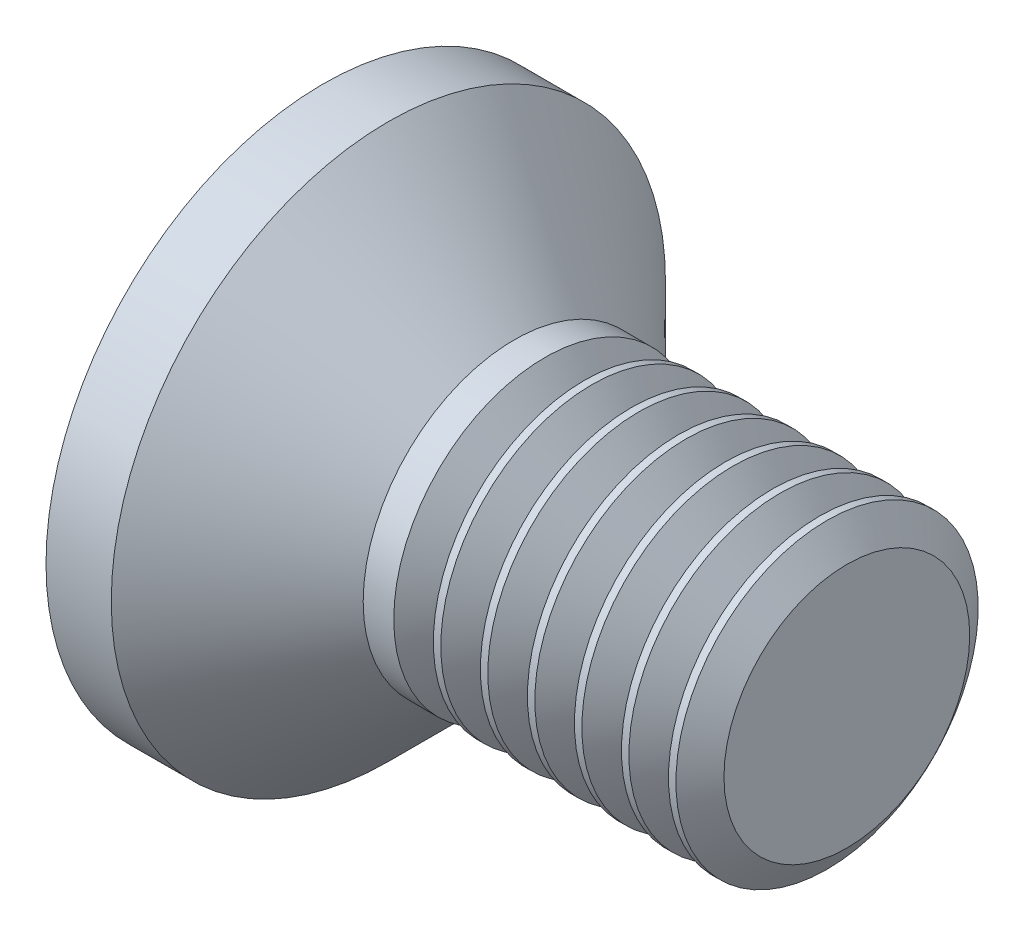
ISO-10303-21;
HEADER;
FILE_DESCRIPTION(('STEP AP214'),'2;1');
FILE_NAME('part.step','',(''),(''),'','','');
FILE_SCHEMA(('AUTOMOTIVE_DESIGN { 1 0 10303 214 1 1 1 1 }'));
ENDSEC;
DATA;
#1=APPLICATION_CONTEXT('core data for automotive mechanical design processes');
#2=APPLICATION_PROTOCOL_DEFINITION('international standard','automotive_design',2000,#1);
#3=PRODUCT_CONTEXT('',#1,'mechanical');
#4=PRODUCT('Part','Part','',(#3));
#5=PRODUCT_RELATED_PRODUCT_CATEGORY('part','',(#4));
#6=PRODUCT_DEFINITION_FORMATION('','',#4);
#7=PRODUCT_DEFINITION_CONTEXT('part definition',#1,'design');
#8=PRODUCT_DEFINITION('design','',#6,#7);
#9=PRODUCT_DEFINITION_SHAPE('','',#8);
#10=(LENGTH_UNIT() NAMED_UNIT(*) SI_UNIT(.MILLI.,.METRE.));
#11=(NAMED_UNIT(*) PLANE_ANGLE_UNIT() SI_UNIT($,.RADIAN.));
#12=(NAMED_UNIT(*) SI_UNIT($,.STERADIAN.) SOLID_ANGLE_UNIT());
#13=UNCERTAINTY_MEASURE_WITH_UNIT(LENGTH_MEASURE(1.E-05),#10,'distance_accuracy_value','');
#14=(GEOMETRIC_REPRESENTATION_CONTEXT(3) GLOBAL_UNCERTAINTY_ASSIGNED_CONTEXT((#13)) GLOBAL_UNIT_ASSIGNED_CONTEXT((#10,
#11,#12)) REPRESENTATION_CONTEXT('',''));
#15=CARTESIAN_POINT('',(0.,0.,0.));
#16=DIRECTION('',(0.,0.,1.));
#17=DIRECTION('',(1.,0.,0.));
#18=AXIS2_PLACEMENT_3D('',#15,#16,#17);
#19=CARTESIAN_POINT('',(7.4,0.,0.));
#20=DIRECTION('',(-1.,0.,0.));
#21=DIRECTION('',(0.,-1.,0.));
#22=AXIS2_PLACEMENT_3D('',#19,#20,#21);
#23=SPHERICAL_SURFACE('',#22,7.4);
#24=CARTESIAN_POINT('',(0.529956332016513,0.,0.));
#25=DIRECTION('',(-1.,0.,0.));
#26=DIRECTION('',(0.,0.,1.));
#27=AXIS2_PLACEMENT_3D('',#24,#25,#26);
#28=CIRCLE('',#27,2.75);
#29=CARTESIAN_POINT('',(0.529956332016513,0.,2.75));
#30=VERTEX_POINT('',#29);
#31=EDGE_CURVE('E158',#30,#30,#28,.T.);
#32=ORIENTED_EDGE('',*,*,#31,.T.);
#33=EDGE_LOOP('',(#32));
#34=FACE_BOUND('',#33,.T.);
#35=CARTESIAN_POINT('',(7.37844022875731,0.,-0.242092852990189));
#36=DIRECTION('',(-0.0887047329662643,0.,-0.996057965356125));
#37=DIRECTION('',(-0.996057965356125,0.,0.0887047329662643));
#38=AXIS2_PLACEMENT_3D('',#35,#36,#37);
#39=CIRCLE('',#38,7.39600745178066);
#40=CARTESIAN_POINT('',(0.185890101969758,1.59933099603895,0.398445409373938));
#41=VERTEX_POINT('',#40);
#42=CARTESIAN_POINT('',(0.0230796751196916,0.41294462120715,0.412944621207152));
#43=VERTEX_POINT('',#42);
#44=EDGE_CURVE('E129',#41,#43,#39,.F.);
#45=ORIENTED_EDGE('',*,*,#44,.T.);
#46=CARTESIAN_POINT('',(7.37844022875731,-0.24209285299019,0.));
#47=DIRECTION('',(-0.0887047329662644,-0.996057965356125,0.));
#48=DIRECTION('',(0.996057965356125,-0.0887047329662644,0.));
#49=AXIS2_PLACEMENT_3D('',#46,#47,#48);
#50=CIRCLE('',#49,7.39600745178066);
#51=CARTESIAN_POINT('',(0.185890101969758,0.398445409373932,1.59933099603895));
#52=VERTEX_POINT('',#51);
#53=EDGE_CURVE('E111',#43,#52,#50,.F.);
#54=ORIENTED_EDGE('',*,*,#53,.T.);
#55=CARTESIAN_POINT('',(5.99170841267437,0.,-2.16946737088841));
#56=DIRECTION('',(0.544482116778557,0.,0.838772450971264));
#57=DIRECTION('',(0.838772450971265,0.,-0.544482116778557));
#58=AXIS2_PLACEMENT_3D('',#55,#56,#57);
#59=CIRCLE('',#58,6.93326230080172);
#60=CARTESIAN_POINT('',(0.185890101969758,-0.398445409373943,1.59933099603894));
#61=VERTEX_POINT('',#60);
#62=EDGE_CURVE('E122',#61,#52,#59,.F.);
#63=ORIENTED_EDGE('',*,*,#62,.F.);
#64=CARTESIAN_POINT('',(7.37844022875731,0.242092852990189,0.));
#65=DIRECTION('',(-0.0887047329662643,0.996057965356125,0.));
#66=DIRECTION('',(-0.996057965356125,-0.0887047329662643,0.));
#67=AXIS2_PLACEMENT_3D('',#64,#65,#66);
#68=CIRCLE('',#67,7.39600745178066);
#69=CARTESIAN_POINT('',(0.0230796751196933,-0.412944621207153,0.412944621207151));
#70=VERTEX_POINT('',#69);
#71=EDGE_CURVE('E188',#61,#70,#68,.F.);
#72=ORIENTED_EDGE('',*,*,#71,.T.);
#73=CARTESIAN_POINT('',(0.185890101969757,-1.59933099603895,0.398445409373938));
#74=VERTEX_POINT('',#73);
#75=EDGE_CURVE('E163',#70,#74,#39,.F.);
#76=ORIENTED_EDGE('',*,*,#75,.T.);
#77=CARTESIAN_POINT('',(5.99170841267437,2.1694673708884,0.));
#78=DIRECTION('',(0.544482116778557,-0.838772450971264,0.));
#79=DIRECTION('',(0.838772450971265,0.544482116778557,0.));
#80=AXIS2_PLACEMENT_3D('',#77,#78,#79);
#81=CIRCLE('',#80,6.93326230080172);
#82=CARTESIAN_POINT('',(0.185890101969757,-1.59933099603895,-0.398445409373938));
#83=VERTEX_POINT('',#82);
#84=EDGE_CURVE('E161',#83,#74,#81,.F.);
#85=ORIENTED_EDGE('',*,*,#84,.F.);
#86=CARTESIAN_POINT('',(7.37844022875731,0.,0.24209285299019));
#87=DIRECTION('',(-0.0887047329662644,0.,0.996057965356125));
#88=DIRECTION('',(0.996057965356125,0.,0.0887047329662644));
#89=AXIS2_PLACEMENT_3D('',#86,#87,#88);
#90=CIRCLE('',#89,7.39600745178066);
#91=CARTESIAN_POINT('',(0.0230796751196933,-0.41294462120715,-0.412944621207152));
#92=VERTEX_POINT('',#91);
#93=EDGE_CURVE('E165',#83,#92,#90,.F.);
#94=ORIENTED_EDGE('',*,*,#93,.T.);
#95=CARTESIAN_POINT('',(0.185890101969757,-0.398445409373932,-1.59933099603895));
#96=VERTEX_POINT('',#95);
#97=EDGE_CURVE('E192',#92,#96,#68,.F.);
#98=ORIENTED_EDGE('',*,*,#97,.T.);
#99=CARTESIAN_POINT('',(5.99170841267437,0.,2.16946737088841));
#100=DIRECTION('',(0.544482116778557,0.,-0.838772450971264));
#101=DIRECTION('',(-0.838772450971265,0.,-0.544482116778557));
#102=AXIS2_PLACEMENT_3D('',#99,#100,#101);
#103=CIRCLE('',#102,6.93326230080172);
#104=CARTESIAN_POINT('',(0.185890101969757,0.398445409373944,-1.59933099603894));
#105=VERTEX_POINT('',#104);
#106=EDGE_CURVE('E123',#105,#96,#103,.F.);
#107=ORIENTED_EDGE('',*,*,#106,.F.);
#108=CARTESIAN_POINT('',(0.0230796751196933,0.412944621207153,-0.412944621207152));
#109=VERTEX_POINT('',#108);
#110=EDGE_CURVE('E148',#105,#109,#50,.F.);
#111=ORIENTED_EDGE('',*,*,#110,.T.);
#112=CARTESIAN_POINT('',(0.185890101969758,1.59933099603895,-0.398445409373938));
#113=VERTEX_POINT('',#112);
#114=EDGE_CURVE('E62',#109,#113,#90,.F.);
#115=ORIENTED_EDGE('',*,*,#114,.T.);
#116=CARTESIAN_POINT('',(5.99170841267437,-2.1694673708884,0.));
#117=DIRECTION('',(0.544482116778557,0.838772450971264,0.));
#118=DIRECTION('',(-0.838772450971265,0.544482116778557,0.));
#119=AXIS2_PLACEMENT_3D('',#116,#117,#118);
#120=CIRCLE('',#119,6.93326230080172);
#121=EDGE_CURVE('E47',#41,#113,#120,.F.);
#122=ORIENTED_EDGE('',*,*,#121,.F.);
#123=EDGE_LOOP('',(#45,#54,#63,#72,#76,#85,#94,#98,#107,#111,#115,#122));
#124=FACE_BOUND('',#123,.T.);
#125=ADVANCED_FACE('F39',(#34,#124),#23,.T.);
#126=CARTESIAN_POINT('',(2.64965289256198,0.,-0.17903305785124));
#127=DIRECTION('',(-0.0887047329662644,0.,0.996057965356125));
#128=DIRECTION('',(0.996057965356125,0.,0.0887047329662644));
#129=AXIS2_PLACEMENT_3D('',#126,#127,#128);
#130=PLANE('',#129);
#131=ORIENTED_EDGE('',*,*,#114,.F.);
#132=DIRECTION('',(0.992162185069946,-0.0883577911596629,0.0883577911596626));
#133=VECTOR('',#132,1.);
#134=CARTESIAN_POINT('',(2.66534787197402,0.177635328998022,-0.177635328998022));
#135=LINE('',#134,#133);
#136=CARTESIAN_POINT('',(2.33,0.207500000000001,-0.207499999999999));
#137=VERTEX_POINT('',#136);
#138=EDGE_CURVE('E170',#109,#137,#135,.T.);
#139=ORIENTED_EDGE('',*,*,#138,.T.);
#140=DIRECTION('',(0.836442139156631,-0.542969414366697,0.0744900188304725));
#141=VECTOR('',#140,1.);
#142=CARTESIAN_POINT('',(0.,1.72,-0.415));
#143=LINE('',#142,#141);
#144=EDGE_CURVE('E132',#113,#137,#143,.T.);
#145=ORIENTED_EDGE('',*,*,#144,.F.);
#146=EDGE_LOOP('',(#131,#139,#145));
#147=FACE_BOUND('',#146,.T.);
#148=ADVANCED_FACE('F169',(#147),#130,.T.);
#149=DIRECTION('',(0.836442139156631,0.542969414366697,0.0744900188304725));
#150=VECTOR('',#149,1.);
#151=CARTESIAN_POINT('',(0.,-1.72,-0.415));
#152=LINE('',#151,#150);
#153=CARTESIAN_POINT('',(2.33,-0.2075,-0.2075));
#154=VERTEX_POINT('',#153);
#155=EDGE_CURVE('E54',#83,#154,#152,.T.);
#156=ORIENTED_EDGE('',*,*,#155,.T.);
#157=DIRECTION('',(-0.992162185069946,-0.0883577911596622,-0.0883577911596626));
#158=VECTOR('',#157,1.);
#159=CARTESIAN_POINT('',(2.66534787197402,-0.177635328998021,-0.177635328998022));
#160=LINE('',#159,#158);
#161=EDGE_CURVE('E190',#154,#92,#160,.T.);
#162=ORIENTED_EDGE('',*,*,#161,.T.);
#163=ORIENTED_EDGE('',*,*,#93,.F.);
#164=EDGE_LOOP('',(#156,#162,#163));
#165=FACE_BOUND('',#164,.T.);
#166=ADVANCED_FACE('F287',(#165),#130,.T.);
#167=CARTESIAN_POINT('',(2.64965289256198,0.,0.17903305785124));
#168=DIRECTION('',(-0.0887047329662643,0.,-0.996057965356125));
#169=DIRECTION('',(-0.996057965356125,0.,0.0887047329662643));
#170=AXIS2_PLACEMENT_3D('',#167,#168,#169);
#171=PLANE('',#170);
#172=DIRECTION('',(0.836442139156631,-0.542969414366697,-0.0744900188304725));
#173=VECTOR('',#172,1.);
#174=CARTESIAN_POINT('',(0.,1.72,0.415));
#175=LINE('',#174,#173);
#176=CARTESIAN_POINT('',(2.33,0.207499999999999,0.207500000000001));
#177=VERTEX_POINT('',#176);
#178=EDGE_CURVE('E127',#41,#177,#175,.T.);
#179=ORIENTED_EDGE('',*,*,#178,.T.);
#180=DIRECTION('',(-0.992162185069947,0.0883577911596623,0.0883577911596626));
#181=VECTOR('',#180,1.);
#182=CARTESIAN_POINT('',(2.66534787197402,0.177635328998021,0.177635328998022));
#183=LINE('',#182,#181);
#184=EDGE_CURVE('E11',#177,#43,#183,.T.);
#185=ORIENTED_EDGE('',*,*,#184,.T.);
#186=ORIENTED_EDGE('',*,*,#44,.F.);
#187=EDGE_LOOP('',(#179,#185,#186));
#188=FACE_BOUND('',#187,.T.);
#189=ADVANCED_FACE('F128',(#188),#171,.T.);
#190=ORIENTED_EDGE('',*,*,#75,.F.);
#191=DIRECTION('',(0.992162185069946,0.0883577911596628,-0.0883577911596625));
#192=VECTOR('',#191,1.);
#193=CARTESIAN_POINT('',(2.66534787197402,-0.177635328998022,0.177635328998022));
#194=LINE('',#193,#192);
#195=CARTESIAN_POINT('',(2.33,-0.2075,0.2075));
#196=VERTEX_POINT('',#195);
#197=EDGE_CURVE('E185',#70,#196,#194,.T.);
#198=ORIENTED_EDGE('',*,*,#197,.T.);
#199=DIRECTION('',(0.836442139156631,0.542969414366697,-0.0744900188304724));
#200=VECTOR('',#199,1.);
#201=CARTESIAN_POINT('',(0.,-1.72,0.415));
#202=LINE('',#201,#200);
#203=EDGE_CURVE('E176',#74,#196,#202,.T.);
#204=ORIENTED_EDGE('',*,*,#203,.F.);
#205=EDGE_LOOP('',(#190,#198,#204));
#206=FACE_BOUND('',#205,.T.);
#207=ADVANCED_FACE('F184',(#206),#171,.T.);
#208=CARTESIAN_POINT('',(-15.875,0.,0.));
#209=DIRECTION('',(-1.,0.,0.));
#210=DIRECTION('',(0.,0.,1.));
#211=AXIS2_PLACEMENT_3D('',#208,#209,#210);
#212=CYLINDRICAL_SURFACE('',#211,2.75);
#213=ORIENTED_EDGE('',*,*,#31,.F.);
#214=EDGE_LOOP('',(#213));
#215=FACE_BOUND('',#214,.T.);
#216=CARTESIAN_POINT('',(1.1776690729551,0.,0.));
#217=DIRECTION('',(-1.,0.,0.));
#218=DIRECTION('',(0.,0.,1.));
#219=AXIS2_PLACEMENT_3D('',#216,#217,#218);
#220=CIRCLE('',#219,2.75);
#221=CARTESIAN_POINT('',(1.1776690729551,0.,2.75));
#222=VERTEX_POINT('',#221);
#223=EDGE_CURVE('E155',#222,#222,#220,.T.);
#224=ORIENTED_EDGE('',*,*,#223,.T.);
#225=EDGE_LOOP('',(#224));
#226=FACE_BOUND('',#225,.T.);
#227=ADVANCED_FACE('F290',(#215,#226),#212,.T.);
#228=CARTESIAN_POINT('',(2.42766907295509,0.,0.));
#229=DIRECTION('',(-1.,0.,0.));
#230=DIRECTION('',(0.,0.,1.));
#231=AXIS2_PLACEMENT_3D('',#228,#229,#230);
#232=CONICAL_SURFACE('',#231,1.5,0.785398163397451);
#233=ORIENTED_EDGE('',*,*,#223,.F.);
#234=EDGE_LOOP('',(#233));
#235=FACE_BOUND('',#234,.T.);
#236=CARTESIAN_POINT('',(2.42766907295509,0.,0.));
#237=DIRECTION('',(-1.,0.,0.));
#238=DIRECTION('',(0.,0.,1.));
#239=AXIS2_PLACEMENT_3D('',#236,#237,#238);
#240=CIRCLE('',#239,1.5);
#241=CARTESIAN_POINT('',(2.42766907295509,0.,1.5));
#242=VERTEX_POINT('',#241);
#243=EDGE_CURVE('E152',#242,#242,#240,.T.);
#244=ORIENTED_EDGE('',*,*,#243,.T.);
#245=EDGE_LOOP('',(#244));
#246=FACE_BOUND('',#245,.T.);
#247=ADVANCED_FACE('F293',(#235,#246),#232,.T.);
#248=CARTESIAN_POINT('',(-15.875,0.,0.));
#249=DIRECTION('',(-1.,0.,0.));
#250=DIRECTION('',(0.,0.,1.));
#251=AXIS2_PLACEMENT_3D('',#248,#249,#250);
#252=CYLINDRICAL_SURFACE('',#251,1.5);
#253=CARTESIAN_POINT('',(2.73126085848727,0.,0.));
#254=DIRECTION('',(-1.,0.,0.));
#255=DIRECTION('',(0.,-1.,0.));
#256=AXIS2_PLACEMENT_3D('',#253,#254,#255);
#257=CIRCLE('',#256,1.5);
#258=CARTESIAN_POINT('',(2.73126085848727,-1.5,0.));
#259=VERTEX_POINT('',#258);
#260=EDGE_CURVE('E214',#259,#259,#257,.T.);
#261=ORIENTED_EDGE('',*,*,#260,.T.);
#262=EDGE_LOOP('',(#261));
#263=FACE_BOUND('',#262,.T.);
#264=ORIENTED_EDGE('',*,*,#243,.F.);
#265=EDGE_LOOP('',(#264));
#266=FACE_BOUND('',#265,.T.);
#267=ADVANCED_FACE('F296',(#263,#266),#252,.T.);
#268=CARTESIAN_POINT('',(2.33,0.2075,-0.2075));
#269=DIRECTION('',(-1.,0.,0.));
#270=DIRECTION('',(0.,0.,1.));
#271=AXIS2_PLACEMENT_3D('',#268,#269,#270);
#272=PLANE('',#271);
#273=DIRECTION('',(0.,1.,0.));
#274=VECTOR('',#273,1.);
#275=CARTESIAN_POINT('',(2.33,-0.2075,-0.2075));
#276=LINE('',#275,#274);
#277=EDGE_CURVE('E145',#154,#137,#276,.T.);
#278=ORIENTED_EDGE('',*,*,#277,.F.);
#279=DIRECTION('',(0.,0.,1.));
#280=VECTOR('',#279,1.);
#281=CARTESIAN_POINT('',(2.33,-0.2075,-0.2075));
#282=LINE('',#281,#280);
#283=EDGE_CURVE('E140',#154,#196,#282,.T.);
#284=ORIENTED_EDGE('',*,*,#283,.T.);
#285=DIRECTION('',(0.,-1.,0.));
#286=VECTOR('',#285,1.);
#287=CARTESIAN_POINT('',(2.33,0.2075,0.2075));
#288=LINE('',#287,#286);
#289=EDGE_CURVE('E119',#177,#196,#288,.T.);
#290=ORIENTED_EDGE('',*,*,#289,.F.);
#291=DIRECTION('',(0.,0.,-1.));
#292=VECTOR('',#291,1.);
#293=CARTESIAN_POINT('',(2.33,0.2075,0.2075));
#294=LINE('',#293,#292);
#295=EDGE_CURVE('E139',#177,#137,#294,.T.);
#296=ORIENTED_EDGE('',*,*,#295,.T.);
#297=EDGE_LOOP('',(#278,#284,#290,#296));
#298=FACE_BOUND('',#297,.T.);
#299=ADVANCED_FACE('F138',(#298),#272,.T.);
#300=CARTESIAN_POINT('',(2.33,0.2075,0.2075));
#301=DIRECTION('',(0.544482116778557,0.838772450971264,0.));
#302=DIRECTION('',(-0.838772450971265,0.544482116778557,0.));
#303=AXIS2_PLACEMENT_3D('',#300,#301,#302);
#304=PLANE('',#303);
#305=ORIENTED_EDGE('',*,*,#121,.T.);
#306=ORIENTED_EDGE('',*,*,#144,.T.);
#307=ORIENTED_EDGE('',*,*,#295,.F.);
#308=ORIENTED_EDGE('',*,*,#178,.F.);
#309=EDGE_LOOP('',(#305,#306,#307,#308));
#310=FACE_BOUND('',#309,.T.);
#311=ADVANCED_FACE('F143',(#310),#304,.F.);
#312=CARTESIAN_POINT('',(2.33,-0.2075,-0.2075));
#313=DIRECTION('',(0.544482116778557,-0.838772450971264,0.));
#314=DIRECTION('',(0.838772450971265,0.544482116778557,0.));
#315=AXIS2_PLACEMENT_3D('',#312,#313,#314);
#316=PLANE('',#315);
#317=ORIENTED_EDGE('',*,*,#84,.T.);
#318=ORIENTED_EDGE('',*,*,#203,.T.);
#319=ORIENTED_EDGE('',*,*,#283,.F.);
#320=ORIENTED_EDGE('',*,*,#155,.F.);
#321=EDGE_LOOP('',(#317,#318,#319,#320));
#322=FACE_BOUND('',#321,.T.);
#323=ADVANCED_FACE('F179',(#322),#316,.F.);
#324=CARTESIAN_POINT('',(2.64965289256198,0.17903305785124,0.));
#325=DIRECTION('',(-0.0887047329662644,-0.996057965356125,0.));
#326=DIRECTION('',(0.996057965356125,-0.0887047329662644,0.));
#327=AXIS2_PLACEMENT_3D('',#324,#325,#326);
#328=PLANE('',#327);
#329=ORIENTED_EDGE('',*,*,#184,.F.);
#330=DIRECTION('',(0.836442139156631,-0.0744900188304706,-0.542969414366698));
#331=VECTOR('',#330,1.);
#332=CARTESIAN_POINT('',(0.,0.414999999999994,1.72));
#333=LINE('',#332,#331);
#334=EDGE_CURVE('E109',#52,#177,#333,.T.);
#335=ORIENTED_EDGE('',*,*,#334,.F.);
#336=ORIENTED_EDGE('',*,*,#53,.F.);
#337=EDGE_LOOP('',(#329,#335,#336));
#338=FACE_BOUND('',#337,.T.);
#339=ADVANCED_FACE('F108',(#338),#328,.T.);
#340=CARTESIAN_POINT('',(2.64965289256198,-0.17903305785124,0.));
#341=DIRECTION('',(-0.0887047329662643,0.996057965356125,0.));
#342=DIRECTION('',(-0.996057965356125,-0.0887047329662643,0.));
#343=AXIS2_PLACEMENT_3D('',#340,#341,#342);
#344=PLANE('',#343);
#345=DIRECTION('',(0.836442139156631,0.0744900188304744,-0.542969414366697));
#346=VECTOR('',#345,1.);
#347=CARTESIAN_POINT('',(0.,-0.415000000000006,1.72));
#348=LINE('',#347,#346);
#349=EDGE_CURVE('E124',#61,#196,#348,.T.);
#350=ORIENTED_EDGE('',*,*,#349,.T.);
#351=ORIENTED_EDGE('',*,*,#197,.F.);
#352=ORIENTED_EDGE('',*,*,#71,.F.);
#353=EDGE_LOOP('',(#350,#351,#352));
#354=FACE_BOUND('',#353,.T.);
#355=ADVANCED_FACE('F314',(#354),#344,.T.);
#356=CARTESIAN_POINT('',(2.33,-0.207500000000001,0.207499999999999));
#357=DIRECTION('',(0.544482116778557,0.,0.838772450971264));
#358=DIRECTION('',(-0.838772450971265,0.,0.544482116778557));
#359=AXIS2_PLACEMENT_3D('',#356,#357,#358);
#360=PLANE('',#359);
#361=ORIENTED_EDGE('',*,*,#62,.T.);
#362=ORIENTED_EDGE('',*,*,#334,.T.);
#363=ORIENTED_EDGE('',*,*,#289,.T.);
#364=ORIENTED_EDGE('',*,*,#349,.F.);
#365=EDGE_LOOP('',(#361,#362,#363,#364));
#366=FACE_BOUND('',#365,.T.);
#367=ADVANCED_FACE('F116',(#366),#360,.F.);
#368=DIRECTION('',(0.836442139156631,-0.0744900188304744,0.542969414366697));
#369=VECTOR('',#368,1.);
#370=CARTESIAN_POINT('',(0.,0.415000000000006,-1.72));
#371=LINE('',#370,#369);
#372=EDGE_CURVE('E203',#105,#137,#371,.T.);
#373=ORIENTED_EDGE('',*,*,#372,.T.);
#374=ORIENTED_EDGE('',*,*,#138,.F.);
#375=ORIENTED_EDGE('',*,*,#110,.F.);
#376=EDGE_LOOP('',(#373,#374,#375));
#377=FACE_BOUND('',#376,.T.);
#378=ADVANCED_FACE('F202',(#377),#328,.T.);
#379=ORIENTED_EDGE('',*,*,#161,.F.);
#380=DIRECTION('',(0.836442139156631,0.0744900188304705,0.542969414366698));
#381=VECTOR('',#380,1.);
#382=CARTESIAN_POINT('',(0.,-0.414999999999994,-1.72));
#383=LINE('',#382,#381);
#384=EDGE_CURVE('E207',#96,#154,#383,.T.);
#385=ORIENTED_EDGE('',*,*,#384,.F.);
#386=ORIENTED_EDGE('',*,*,#97,.F.);
#387=EDGE_LOOP('',(#379,#385,#386));
#388=FACE_BOUND('',#387,.T.);
#389=ADVANCED_FACE('F313',(#388),#344,.T.);
#390=CARTESIAN_POINT('',(2.33,0.207500000000001,-0.207499999999999));
#391=DIRECTION('',(0.544482116778557,0.,-0.838772450971264));
#392=DIRECTION('',(0.838772450971265,0.,0.544482116778557));
#393=AXIS2_PLACEMENT_3D('',#390,#391,#392);
#394=PLANE('',#393);
#395=ORIENTED_EDGE('',*,*,#106,.T.);
#396=ORIENTED_EDGE('',*,*,#384,.T.);
#397=ORIENTED_EDGE('',*,*,#277,.T.);
#398=ORIENTED_EDGE('',*,*,#372,.F.);
#399=EDGE_LOOP('',(#395,#396,#397,#398));
#400=FACE_BOUND('',#399,.T.);
#401=ADVANCED_FACE('F205',(#400),#394,.F.);
#402=CARTESIAN_POINT('',(3.12407728742291,0.,0.));
#403=DIRECTION('',(1.,0.,0.));
#404=DIRECTION('',(0.,1.,0.));
#405=AXIS2_PLACEMENT_3D('',#402,#403,#404);
#406=CONICAL_SURFACE('',#405,1.5,0.959931088596885);
#407=CARTESIAN_POINT('',(2.92766907295509,0.,0.));
#408=DIRECTION('',(-1.,0.,0.));
#409=DIRECTION('',(0.,-1.,0.));
#410=AXIS2_PLACEMENT_3D('',#407,#408,#409);
#411=CIRCLE('',#410,1.2195);
#412=CARTESIAN_POINT('',(2.92766907295509,-1.2195,0.));
#413=VERTEX_POINT('',#412);
#414=EDGE_CURVE('E217',#413,#413,#411,.T.);
#415=ORIENTED_EDGE('',*,*,#414,.F.);
#416=EDGE_LOOP('',(#415));
#417=FACE_BOUND('',#416,.T.);
#418=CARTESIAN_POINT('',(3.12407728742291,0.,0.));
#419=DIRECTION('',(-1.,0.,0.));
#420=DIRECTION('',(0.,-1.,0.));
#421=AXIS2_PLACEMENT_3D('',#418,#419,#420);
#422=CIRCLE('',#421,1.5);
#423=CARTESIAN_POINT('',(3.12407728742291,-1.5,0.));
#424=VERTEX_POINT('',#423);
#425=EDGE_CURVE('E210',#424,#424,#422,.T.);
#426=ORIENTED_EDGE('',*,*,#425,.T.);
#427=EDGE_LOOP('',(#426));
#428=FACE_BOUND('',#427,.T.);
#429=ADVANCED_FACE('F312',(#417,#428),#406,.T.);
#430=CARTESIAN_POINT('',(2.92766907295509,0.,0.));
#431=DIRECTION('',(-1.,0.,0.));
#432=DIRECTION('',(0.,-1.,0.));
#433=AXIS2_PLACEMENT_3D('',#430,#431,#432);
#434=CONICAL_SURFACE('',#433,1.2195,0.959931088596876);
#435=ORIENTED_EDGE('',*,*,#260,.F.);
#436=EDGE_LOOP('',(#435));
#437=FACE_BOUND('',#436,.T.);
#438=ORIENTED_EDGE('',*,*,#414,.T.);
#439=EDGE_LOOP('',(#438));
#440=FACE_BOUND('',#439,.T.);
#441=ADVANCED_FACE('F323',(#437,#440),#434,.T.);
#442=CARTESIAN_POINT('',(3.19792752515393,0.,0.));
#443=DIRECTION('',(-1.,0.,0.));
#444=DIRECTION('',(0.,-1.,0.));
#445=AXIS2_PLACEMENT_3D('',#442,#443,#444);
#446=CIRCLE('',#445,1.5);
#447=CARTESIAN_POINT('',(3.19792752515393,-1.5,0.));
#448=VERTEX_POINT('',#447);
#449=EDGE_CURVE('E223',#448,#448,#446,.T.);
#450=ORIENTED_EDGE('',*,*,#449,.T.);
#451=EDGE_LOOP('',(#450));
#452=FACE_BOUND('',#451,.T.);
#453=ORIENTED_EDGE('',*,*,#425,.F.);
#454=EDGE_LOOP('',(#453));
#455=FACE_BOUND('',#454,.T.);
#456=ADVANCED_FACE('F301',(#452,#455),#252,.T.);
#457=CARTESIAN_POINT('',(3.59074395408958,0.,0.));
#458=DIRECTION('',(1.,0.,0.));
#459=DIRECTION('',(0.,1.,0.));
#460=AXIS2_PLACEMENT_3D('',#457,#458,#459);
#461=CONICAL_SURFACE('',#460,1.5,0.959931088596885);
#462=CARTESIAN_POINT('',(3.39433573962176,0.,0.));
#463=DIRECTION('',(-1.,0.,0.));
#464=DIRECTION('',(0.,-1.,0.));
#465=AXIS2_PLACEMENT_3D('',#462,#463,#464);
#466=CIRCLE('',#465,1.2195);
#467=CARTESIAN_POINT('',(3.39433573962176,-1.2195,0.));
#468=VERTEX_POINT('',#467);
#469=EDGE_CURVE('E226',#468,#468,#466,.T.);
#470=ORIENTED_EDGE('',*,*,#469,.F.);
#471=EDGE_LOOP('',(#470));
#472=FACE_BOUND('',#471,.T.);
#473=CARTESIAN_POINT('',(3.59074395408958,0.,0.));
#474=DIRECTION('',(-1.,0.,0.));
#475=DIRECTION('',(0.,-1.,0.));
#476=AXIS2_PLACEMENT_3D('',#473,#474,#475);
#477=CIRCLE('',#476,1.5);
#478=CARTESIAN_POINT('',(3.59074395408958,-1.5,0.));
#479=VERTEX_POINT('',#478);
#480=EDGE_CURVE('E220',#479,#479,#477,.T.);
#481=ORIENTED_EDGE('',*,*,#480,.T.);
#482=EDGE_LOOP('',(#481));
#483=FACE_BOUND('',#482,.T.);
#484=ADVANCED_FACE('F328',(#472,#483),#461,.T.);
#485=CARTESIAN_POINT('',(3.39433573962176,0.,0.));
#486=DIRECTION('',(-1.,0.,0.));
#487=DIRECTION('',(0.,-1.,0.));
#488=AXIS2_PLACEMENT_3D('',#485,#486,#487);
#489=CONICAL_SURFACE('',#488,1.2195,0.959931088596876);
#490=ORIENTED_EDGE('',*,*,#449,.F.);
#491=EDGE_LOOP('',(#490));
#492=FACE_BOUND('',#491,.T.);
#493=ORIENTED_EDGE('',*,*,#469,.T.);
#494=EDGE_LOOP('',(#493));
#495=FACE_BOUND('',#494,.T.);
#496=ADVANCED_FACE('F331',(#492,#495),#489,.T.);
#497=CARTESIAN_POINT('',(3.6645941918206,0.,0.));
#498=DIRECTION('',(-1.,0.,0.));
#499=DIRECTION('',(0.,-1.,0.));
#500=AXIS2_PLACEMENT_3D('',#497,#498,#499);
#501=CIRCLE('',#500,1.5);
#502=CARTESIAN_POINT('',(3.6645941918206,-1.5,0.));
#503=VERTEX_POINT('',#502);
#504=EDGE_CURVE('E232',#503,#503,#501,.T.);
#505=ORIENTED_EDGE('',*,*,#504,.T.);
#506=EDGE_LOOP('',(#505));
#507=FACE_BOUND('',#506,.T.);
#508=ORIENTED_EDGE('',*,*,#480,.F.);
#509=EDGE_LOOP('',(#508));
#510=FACE_BOUND('',#509,.T.);
#511=ADVANCED_FACE('F335',(#507,#510),#252,.T.);
#512=CARTESIAN_POINT('',(4.05741062075625,0.,0.));
#513=DIRECTION('',(1.,0.,0.));
#514=DIRECTION('',(0.,1.,0.));
#515=AXIS2_PLACEMENT_3D('',#512,#513,#514);
#516=CONICAL_SURFACE('',#515,1.5,0.959931088596885);
#517=CARTESIAN_POINT('',(3.86100240628842,0.,0.));
#518=DIRECTION('',(-1.,0.,0.));
#519=DIRECTION('',(0.,-1.,0.));
#520=AXIS2_PLACEMENT_3D('',#517,#518,#519);
#521=CIRCLE('',#520,1.2195);
#522=CARTESIAN_POINT('',(3.86100240628842,-1.2195,0.));
#523=VERTEX_POINT('',#522);
#524=EDGE_CURVE('E235',#523,#523,#521,.T.);
#525=ORIENTED_EDGE('',*,*,#524,.F.);
#526=EDGE_LOOP('',(#525));
#527=FACE_BOUND('',#526,.T.);
#528=CARTESIAN_POINT('',(4.05741062075625,0.,0.));
#529=DIRECTION('',(-1.,0.,0.));
#530=DIRECTION('',(0.,-1.,0.));
#531=AXIS2_PLACEMENT_3D('',#528,#529,#530);
#532=CIRCLE('',#531,1.5);
#533=CARTESIAN_POINT('',(4.05741062075625,-1.5,0.));
#534=VERTEX_POINT('',#533);
#535=EDGE_CURVE('E229',#534,#534,#532,.T.);
#536=ORIENTED_EDGE('',*,*,#535,.T.);
#537=EDGE_LOOP('',(#536));
#538=FACE_BOUND('',#537,.T.);
#539=ADVANCED_FACE('F337',(#527,#538),#516,.T.);
#540=CARTESIAN_POINT('',(3.86100240628842,0.,0.));
#541=DIRECTION('',(-1.,0.,0.));
#542=DIRECTION('',(0.,-1.,0.));
#543=AXIS2_PLACEMENT_3D('',#540,#541,#542);
#544=CONICAL_SURFACE('',#543,1.2195,0.959931088596876);
#545=ORIENTED_EDGE('',*,*,#504,.F.);
#546=EDGE_LOOP('',(#545));
#547=FACE_BOUND('',#546,.T.);
#548=ORIENTED_EDGE('',*,*,#524,.T.);
#549=EDGE_LOOP('',(#548));
#550=FACE_BOUND('',#549,.T.);
#551=ADVANCED_FACE('F340',(#547,#550),#544,.T.);
#552=CARTESIAN_POINT('',(4.13126085848727,0.,0.));
#553=DIRECTION('',(-1.,0.,0.));
#554=DIRECTION('',(0.,-1.,0.));
#555=AXIS2_PLACEMENT_3D('',#552,#553,#554);
#556=CIRCLE('',#555,1.5);
#557=CARTESIAN_POINT('',(4.13126085848727,-1.5,0.));
#558=VERTEX_POINT('',#557);
#559=EDGE_CURVE('E241',#558,#558,#556,.T.);
#560=ORIENTED_EDGE('',*,*,#559,.T.);
#561=EDGE_LOOP('',(#560));
#562=FACE_BOUND('',#561,.T.);
#563=ORIENTED_EDGE('',*,*,#535,.F.);
#564=EDGE_LOOP('',(#563));
#565=FACE_BOUND('',#564,.T.);
#566=ADVANCED_FACE('F344',(#562,#565),#252,.T.);
#567=CARTESIAN_POINT('',(4.52407728742291,0.,0.));
#568=DIRECTION('',(1.,0.,0.));
#569=DIRECTION('',(0.,1.,0.));
#570=AXIS2_PLACEMENT_3D('',#567,#568,#569);
#571=CONICAL_SURFACE('',#570,1.5,0.959931088596885);
#572=CARTESIAN_POINT('',(4.32766907295509,0.,0.));
#573=DIRECTION('',(-1.,0.,0.));
#574=DIRECTION('',(0.,-1.,0.));
#575=AXIS2_PLACEMENT_3D('',#572,#573,#574);
#576=CIRCLE('',#575,1.2195);
#577=CARTESIAN_POINT('',(4.32766907295509,-1.2195,0.));
#578=VERTEX_POINT('',#577);
#579=EDGE_CURVE('E244',#578,#578,#576,.T.);
#580=ORIENTED_EDGE('',*,*,#579,.F.);
#581=EDGE_LOOP('',(#580));
#582=FACE_BOUND('',#581,.T.);
#583=CARTESIAN_POINT('',(4.52407728742291,0.,0.));
#584=DIRECTION('',(-1.,0.,0.));
#585=DIRECTION('',(0.,-1.,0.));
#586=AXIS2_PLACEMENT_3D('',#583,#584,#585);
#587=CIRCLE('',#586,1.5);
#588=CARTESIAN_POINT('',(4.52407728742291,-1.5,0.));
#589=VERTEX_POINT('',#588);
#590=EDGE_CURVE('E238',#589,#589,#587,.T.);
#591=ORIENTED_EDGE('',*,*,#590,.T.);
#592=EDGE_LOOP('',(#591));
#593=FACE_BOUND('',#592,.T.);
#594=ADVANCED_FACE('F346',(#582,#593),#571,.T.);
#595=CARTESIAN_POINT('',(4.32766907295509,0.,0.));
#596=DIRECTION('',(-1.,0.,0.));
#597=DIRECTION('',(0.,-1.,0.));
#598=AXIS2_PLACEMENT_3D('',#595,#596,#597);
#599=CONICAL_SURFACE('',#598,1.2195,0.959931088596876);
#600=ORIENTED_EDGE('',*,*,#559,.F.);
#601=EDGE_LOOP('',(#600));
#602=FACE_BOUND('',#601,.T.);
#603=ORIENTED_EDGE('',*,*,#579,.T.);
#604=EDGE_LOOP('',(#603));
#605=FACE_BOUND('',#604,.T.);
#606=ADVANCED_FACE('F349',(#602,#605),#599,.T.);
#607=CARTESIAN_POINT('',(4.59792752515393,0.,0.));
#608=DIRECTION('',(-1.,0.,0.));
#609=DIRECTION('',(0.,-1.,0.));
#610=AXIS2_PLACEMENT_3D('',#607,#608,#609);
#611=CIRCLE('',#610,1.5);
#612=CARTESIAN_POINT('',(4.59792752515393,-1.5,0.));
#613=VERTEX_POINT('',#612);
#614=EDGE_CURVE('E250',#613,#613,#611,.T.);
#615=ORIENTED_EDGE('',*,*,#614,.T.);
#616=EDGE_LOOP('',(#615));
#617=FACE_BOUND('',#616,.T.);
#618=ORIENTED_EDGE('',*,*,#590,.F.);
#619=EDGE_LOOP('',(#618));
#620=FACE_BOUND('',#619,.T.);
#621=ADVANCED_FACE('F353',(#617,#620),#252,.T.);
#622=CARTESIAN_POINT('',(4.99074395408958,0.,0.));
#623=DIRECTION('',(1.,0.,0.));
#624=DIRECTION('',(0.,1.,0.));
#625=AXIS2_PLACEMENT_3D('',#622,#623,#624);
#626=CONICAL_SURFACE('',#625,1.5,0.959931088596885);
#627=CARTESIAN_POINT('',(4.79433573962176,0.,0.));
#628=DIRECTION('',(-1.,0.,0.));
#629=DIRECTION('',(0.,-1.,0.));
#630=AXIS2_PLACEMENT_3D('',#627,#628,#629);
#631=CIRCLE('',#630,1.2195);
#632=CARTESIAN_POINT('',(4.79433573962176,-1.2195,0.));
#633=VERTEX_POINT('',#632);
#634=EDGE_CURVE('E253',#633,#633,#631,.T.);
#635=ORIENTED_EDGE('',*,*,#634,.F.);
#636=EDGE_LOOP('',(#635));
#637=FACE_BOUND('',#636,.T.);
#638=CARTESIAN_POINT('',(4.99074395408958,0.,0.));
#639=DIRECTION('',(-1.,0.,0.));
#640=DIRECTION('',(0.,-1.,0.));
#641=AXIS2_PLACEMENT_3D('',#638,#639,#640);
#642=CIRCLE('',#641,1.5);
#643=CARTESIAN_POINT('',(4.99074395408958,-1.5,0.));
#644=VERTEX_POINT('',#643);
#645=EDGE_CURVE('E247',#644,#644,#642,.T.);
#646=ORIENTED_EDGE('',*,*,#645,.T.);
#647=EDGE_LOOP('',(#646));
#648=FACE_BOUND('',#647,.T.);
#649=ADVANCED_FACE('F355',(#637,#648),#626,.T.);
#650=CARTESIAN_POINT('',(4.79433573962176,0.,0.));
#651=DIRECTION('',(-1.,0.,0.));
#652=DIRECTION('',(0.,-1.,0.));
#653=AXIS2_PLACEMENT_3D('',#650,#651,#652);
#654=CONICAL_SURFACE('',#653,1.2195,0.959931088596876);
#655=ORIENTED_EDGE('',*,*,#614,.F.);
#656=EDGE_LOOP('',(#655));
#657=FACE_BOUND('',#656,.T.);
#658=ORIENTED_EDGE('',*,*,#634,.T.);
#659=EDGE_LOOP('',(#658));
#660=FACE_BOUND('',#659,.T.);
#661=ADVANCED_FACE('F358',(#657,#660),#654,.T.);
#662=CARTESIAN_POINT('',(5.0645941918206,0.,0.));
#663=DIRECTION('',(-1.,0.,0.));
#664=DIRECTION('',(0.,-1.,0.));
#665=AXIS2_PLACEMENT_3D('',#662,#663,#664);
#666=CIRCLE('',#665,1.5);
#667=CARTESIAN_POINT('',(5.0645941918206,-1.5,0.));
#668=VERTEX_POINT('',#667);
#669=EDGE_CURVE('E259',#668,#668,#666,.T.);
#670=ORIENTED_EDGE('',*,*,#669,.T.);
#671=EDGE_LOOP('',(#670));
#672=FACE_BOUND('',#671,.T.);
#673=ORIENTED_EDGE('',*,*,#645,.F.);
#674=EDGE_LOOP('',(#673));
#675=FACE_BOUND('',#674,.T.);
#676=ADVANCED_FACE('F362',(#672,#675),#252,.T.);
#677=CARTESIAN_POINT('',(5.45741062075625,0.,0.));
#678=DIRECTION('',(1.,0.,0.));
#679=DIRECTION('',(0.,1.,0.));
#680=AXIS2_PLACEMENT_3D('',#677,#678,#679);
#681=CONICAL_SURFACE('',#680,1.5,0.959931088596885);
#682=CARTESIAN_POINT('',(5.26100240628842,0.,0.));
#683=DIRECTION('',(-1.,0.,0.));
#684=DIRECTION('',(0.,-1.,0.));
#685=AXIS2_PLACEMENT_3D('',#682,#683,#684);
#686=CIRCLE('',#685,1.2195);
#687=CARTESIAN_POINT('',(5.26100240628842,-1.2195,0.));
#688=VERTEX_POINT('',#687);
#689=EDGE_CURVE('E262',#688,#688,#686,.T.);
#690=ORIENTED_EDGE('',*,*,#689,.F.);
#691=EDGE_LOOP('',(#690));
#692=FACE_BOUND('',#691,.T.);
#693=CARTESIAN_POINT('',(5.45741062075625,0.,0.));
#694=DIRECTION('',(-1.,0.,0.));
#695=DIRECTION('',(0.,-1.,0.));
#696=AXIS2_PLACEMENT_3D('',#693,#694,#695);
#697=CIRCLE('',#696,1.5);
#698=CARTESIAN_POINT('',(5.45741062075625,-1.5,0.));
#699=VERTEX_POINT('',#698);
#700=EDGE_CURVE('E256',#699,#699,#697,.T.);
#701=ORIENTED_EDGE('',*,*,#700,.T.);
#702=EDGE_LOOP('',(#701));
#703=FACE_BOUND('',#702,.T.);
#704=ADVANCED_FACE('F364',(#692,#703),#681,.T.);
#705=CARTESIAN_POINT('',(5.26100240628842,0.,0.));
#706=DIRECTION('',(-1.,0.,0.));
#707=DIRECTION('',(0.,-1.,0.));
#708=AXIS2_PLACEMENT_3D('',#705,#706,#707);
#709=CONICAL_SURFACE('',#708,1.2195,0.959931088596876);
#710=ORIENTED_EDGE('',*,*,#669,.F.);
#711=EDGE_LOOP('',(#710));
#712=FACE_BOUND('',#711,.T.);
#713=ORIENTED_EDGE('',*,*,#689,.T.);
#714=EDGE_LOOP('',(#713));
#715=FACE_BOUND('',#714,.T.);
#716=ADVANCED_FACE('F367',(#712,#715),#709,.T.);
#717=CARTESIAN_POINT('',(5.53126085848726,0.,0.));
#718=DIRECTION('',(-1.,0.,0.));
#719=DIRECTION('',(0.,-1.,0.));
#720=AXIS2_PLACEMENT_3D('',#717,#718,#719);
#721=CIRCLE('',#720,1.5);
#722=CARTESIAN_POINT('',(5.53126085848726,-1.5,0.));
#723=VERTEX_POINT('',#722);
#724=EDGE_CURVE('E265',#723,#723,#721,.T.);
#725=ORIENTED_EDGE('',*,*,#724,.T.);
#726=EDGE_LOOP('',(#725));
#727=FACE_BOUND('',#726,.T.);
#728=ORIENTED_EDGE('',*,*,#700,.F.);
#729=EDGE_LOOP('',(#728));
#730=FACE_BOUND('',#729,.T.);
#731=ADVANCED_FACE('F278',(#727,#730),#252,.T.);
#732=CARTESIAN_POINT('',(5.72766907295509,0.,0.));
#733=DIRECTION('',(-1.,0.,0.));
#734=DIRECTION('',(0.,-1.,0.));
#735=AXIS2_PLACEMENT_3D('',#732,#733,#734);
#736=CONICAL_SURFACE('',#735,1.2195,0.959931088596876);
#737=ORIENTED_EDGE('',*,*,#724,.F.);
#738=EDGE_LOOP('',(#737));
#739=FACE_BOUND('',#738,.T.);
#740=CARTESIAN_POINT('',(5.72766907295509,0.,0.));
#741=DIRECTION('',(-1.,0.,0.));
#742=DIRECTION('',(0.,-1.,0.));
#743=AXIS2_PLACEMENT_3D('',#740,#741,#742);
#744=CIRCLE('',#743,1.2195);
#745=CARTESIAN_POINT('',(5.72766907295509,-1.2195,0.));
#746=VERTEX_POINT('',#745);
#747=EDGE_CURVE('E268',#746,#746,#744,.T.);
#748=ORIENTED_EDGE('',*,*,#747,.T.);
#749=EDGE_LOOP('',(#748));
#750=FACE_BOUND('',#749,.T.);
#751=ADVANCED_FACE('F272',(#739,#750),#736,.T.);
#752=CARTESIAN_POINT('',(5.72766907295509,0.,0.));
#753=DIRECTION('',(-1.,0.,0.));
#754=DIRECTION('',(0.,0.,1.));
#755=AXIS2_PLACEMENT_3D('',#752,#753,#754);
#756=PLANE('',#755);
#757=ORIENTED_EDGE('',*,*,#747,.F.);
#758=EDGE_LOOP('',(#757));
#759=FACE_BOUND('',#758,.T.);
#760=ADVANCED_FACE('F41',(#759),#756,.F.);
#761=CLOSED_SHELL('',(#125,#148,#166,#189,#207,#227,#247,#267,#299,#311,#323,#339,#355,#367,
#378,#389,#401,#429,#441,#456,#484,#496,#511,#539,#551,#566,#594,#606,#621,#649,#661,#676,#704,
#716,#731,#751,#760));
#762=MANIFOLD_SOLID_BREP('B2',#761);
#763=ADVANCED_BREP_SHAPE_REPRESENTATION('',(#18,#762),#14);
#764=SHAPE_DEFINITION_REPRESENTATION(#9,#763);
ENDSEC;
END-ISO-10303-21;
